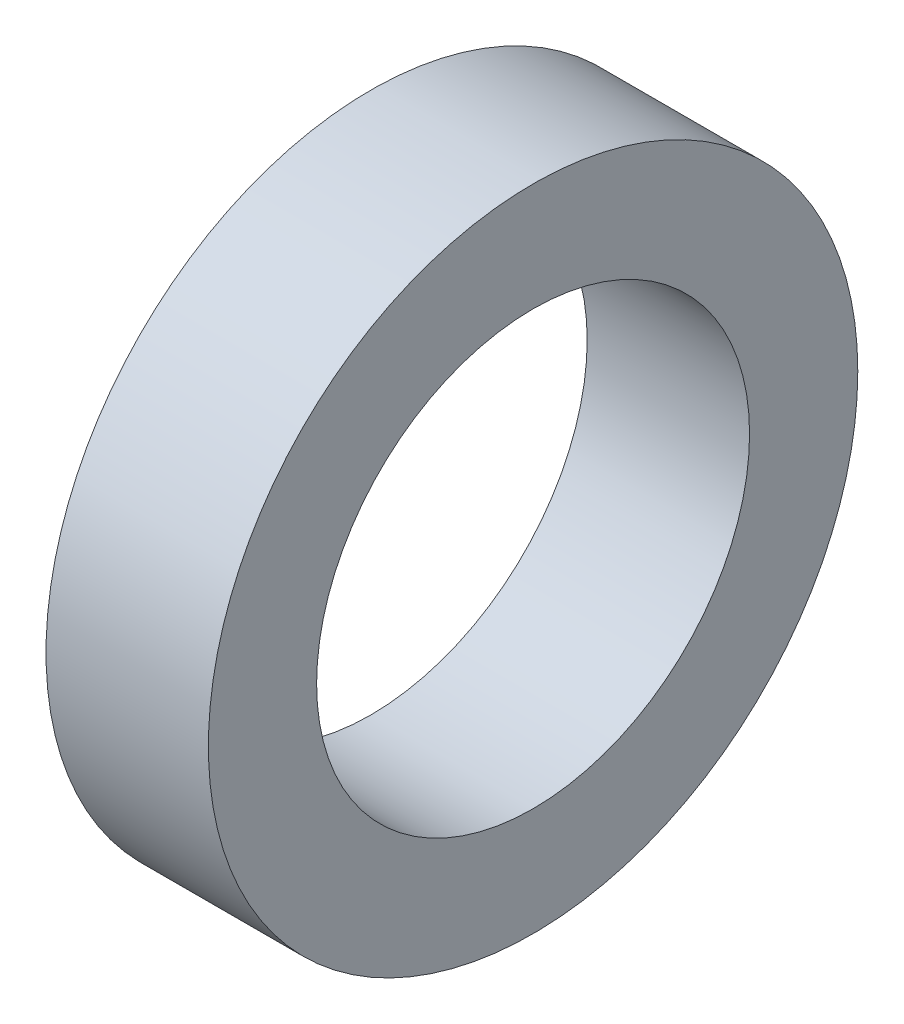
ISO-10303-21;
HEADER;
FILE_DESCRIPTION(('STEP AP214'),'2;1');
FILE_NAME('part.step','',(''),(''),'','','');
FILE_SCHEMA(('AUTOMOTIVE_DESIGN { 1 0 10303 214 1 1 1 1 }'));
ENDSEC;
DATA;
#1=APPLICATION_CONTEXT('core data for automotive mechanical design processes');
#2=APPLICATION_PROTOCOL_DEFINITION('international standard','automotive_design',2000,#1);
#3=PRODUCT_CONTEXT('',#1,'mechanical');
#4=PRODUCT('Part','Part','',(#3));
#5=PRODUCT_RELATED_PRODUCT_CATEGORY('part','',(#4));
#6=PRODUCT_DEFINITION_FORMATION('','',#4);
#7=PRODUCT_DEFINITION_CONTEXT('part definition',#1,'design');
#8=PRODUCT_DEFINITION('design','',#6,#7);
#9=PRODUCT_DEFINITION_SHAPE('','',#8);
#10=(LENGTH_UNIT() NAMED_UNIT(*) SI_UNIT(.MILLI.,.METRE.));
#11=(NAMED_UNIT(*) PLANE_ANGLE_UNIT() SI_UNIT($,.RADIAN.));
#12=(NAMED_UNIT(*) SI_UNIT($,.STERADIAN.) SOLID_ANGLE_UNIT());
#13=UNCERTAINTY_MEASURE_WITH_UNIT(LENGTH_MEASURE(1.E-05),#10,'distance_accuracy_value','');
#14=(GEOMETRIC_REPRESENTATION_CONTEXT(3) GLOBAL_UNCERTAINTY_ASSIGNED_CONTEXT((#13)) GLOBAL_UNIT_ASSIGNED_CONTEXT((#10,
#11,#12)) REPRESENTATION_CONTEXT('',''));
#15=CARTESIAN_POINT('',(0.,0.,0.));
#16=DIRECTION('',(0.,0.,1.));
#17=DIRECTION('',(1.,0.,0.));
#18=AXIS2_PLACEMENT_3D('',#15,#16,#17);
#19=CARTESIAN_POINT('',(15.,0.,0.));
#20=DIRECTION('',(1.,0.,0.));
#21=DIRECTION('',(0.,0.,-1.));
#22=AXIS2_PLACEMENT_3D('',#19,#20,#21);
#23=PLANE('',#22);
#24=CARTESIAN_POINT('',(15.,0.,0.));
#25=DIRECTION('',(1.,0.,0.));
#26=DIRECTION('',(0.,0.,-1.));
#27=AXIS2_PLACEMENT_3D('',#24,#25,#26);
#28=CIRCLE('',#27,30.);
#29=CARTESIAN_POINT('',(15.,0.,-30.));
#30=VERTEX_POINT('',#29);
#31=EDGE_CURVE('E10',#30,#30,#28,.T.);
#32=ORIENTED_EDGE('',*,*,#31,.T.);
#33=EDGE_LOOP('',(#32));
#34=FACE_BOUND('',#33,.T.);
#35=CARTESIAN_POINT('',(15.,0.,0.));
#36=DIRECTION('',(1.,0.,0.));
#37=DIRECTION('',(0.,0.,-1.));
#38=AXIS2_PLACEMENT_3D('',#35,#36,#37);
#39=CIRCLE('',#38,20.);
#40=CARTESIAN_POINT('',(15.,0.,-20.));
#41=VERTEX_POINT('',#40);
#42=EDGE_CURVE('E43',#41,#41,#39,.T.);
#43=ORIENTED_EDGE('',*,*,#42,.F.);
#44=EDGE_LOOP('',(#43));
#45=FACE_BOUND('',#44,.T.);
#46=ADVANCED_FACE('F32',(#34,#45),#23,.T.);
#47=CARTESIAN_POINT('',(0.,0.,0.));
#48=DIRECTION('',(1.,0.,0.));
#49=DIRECTION('',(0.,0.,-1.));
#50=AXIS2_PLACEMENT_3D('',#47,#48,#49);
#51=PLANE('',#50);
#52=CARTESIAN_POINT('',(0.,0.,0.));
#53=DIRECTION('',(1.,0.,0.));
#54=DIRECTION('',(0.,0.,-1.));
#55=AXIS2_PLACEMENT_3D('',#52,#53,#54);
#56=CIRCLE('',#55,30.);
#57=CARTESIAN_POINT('',(0.,0.,-30.));
#58=VERTEX_POINT('',#57);
#59=EDGE_CURVE('E36',#58,#58,#56,.T.);
#60=ORIENTED_EDGE('',*,*,#59,.F.);
#61=EDGE_LOOP('',(#60));
#62=FACE_BOUND('',#61,.T.);
#63=CARTESIAN_POINT('',(0.,0.,0.));
#64=DIRECTION('',(1.,0.,0.));
#65=DIRECTION('',(0.,0.,-1.));
#66=AXIS2_PLACEMENT_3D('',#63,#64,#65);
#67=CIRCLE('',#66,20.);
#68=CARTESIAN_POINT('',(0.,0.,-20.));
#69=VERTEX_POINT('',#68);
#70=EDGE_CURVE('E45',#69,#69,#67,.T.);
#71=ORIENTED_EDGE('',*,*,#70,.T.);
#72=EDGE_LOOP('',(#71));
#73=FACE_BOUND('',#72,.T.);
#74=ADVANCED_FACE('F55',(#62,#73),#51,.F.);
#75=CARTESIAN_POINT('',(15.,0.,0.));
#76=DIRECTION('',(-1.,0.,0.));
#77=DIRECTION('',(0.,0.,1.));
#78=AXIS2_PLACEMENT_3D('',#75,#76,#77);
#79=CYLINDRICAL_SURFACE('',#78,30.);
#80=ORIENTED_EDGE('',*,*,#31,.F.);
#81=EDGE_LOOP('',(#80));
#82=FACE_BOUND('',#81,.T.);
#83=ORIENTED_EDGE('',*,*,#59,.T.);
#84=EDGE_LOOP('',(#83));
#85=FACE_BOUND('',#84,.T.);
#86=ADVANCED_FACE('F34',(#82,#85),#79,.T.);
#87=CARTESIAN_POINT('',(15.,0.,0.));
#88=DIRECTION('',(-1.,0.,0.));
#89=DIRECTION('',(0.,0.,1.));
#90=AXIS2_PLACEMENT_3D('',#87,#88,#89);
#91=CYLINDRICAL_SURFACE('',#90,20.);
#92=ORIENTED_EDGE('',*,*,#42,.T.);
#93=EDGE_LOOP('',(#92));
#94=FACE_BOUND('',#93,.T.);
#95=ORIENTED_EDGE('',*,*,#70,.F.);
#96=EDGE_LOOP('',(#95));
#97=FACE_BOUND('',#96,.T.);
#98=ADVANCED_FACE('F51',(#94,#97),#91,.F.);
#99=CLOSED_SHELL('',(#46,#74,#86,#98));
#100=MANIFOLD_SOLID_BREP('B2',#99);
#101=ADVANCED_BREP_SHAPE_REPRESENTATION('',(#18,#100),#14);
#102=SHAPE_DEFINITION_REPRESENTATION(#9,#101);
ENDSEC;
END-ISO-10303-21;
